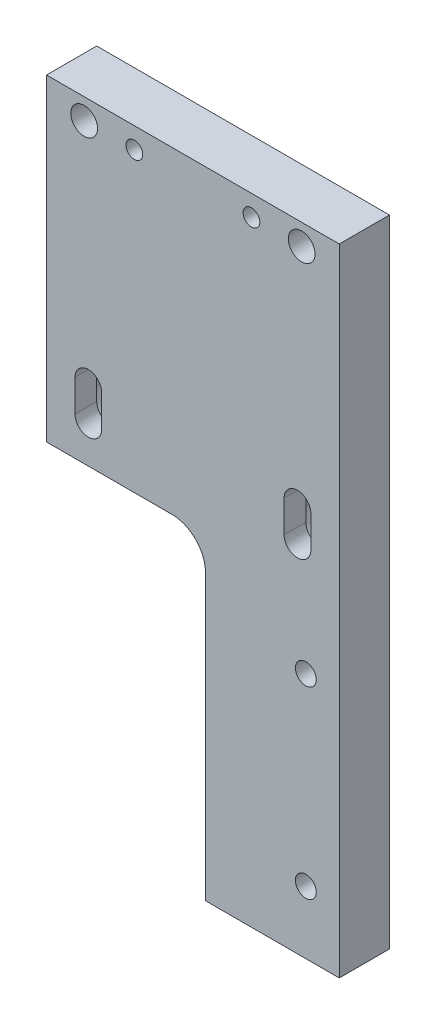
ISO-10303-21;
HEADER;
FILE_DESCRIPTION(('STEP AP214'),'2;1');
FILE_NAME('part.step','',(''),(''),'','','');
FILE_SCHEMA(('AUTOMOTIVE_DESIGN { 1 0 10303 214 1 1 1 1 }'));
ENDSEC;
DATA;
#1=APPLICATION_CONTEXT('core data for automotive mechanical design processes');
#2=APPLICATION_PROTOCOL_DEFINITION('international standard','automotive_design',2000,#1);
#3=PRODUCT_CONTEXT('',#1,'mechanical');
#4=PRODUCT('Part','Part','',(#3));
#5=PRODUCT_RELATED_PRODUCT_CATEGORY('part','',(#4));
#6=PRODUCT_DEFINITION_FORMATION('','',#4);
#7=PRODUCT_DEFINITION_CONTEXT('part definition',#1,'design');
#8=PRODUCT_DEFINITION('design','',#6,#7);
#9=PRODUCT_DEFINITION_SHAPE('','',#8);
#10=(LENGTH_UNIT() NAMED_UNIT(*) SI_UNIT(.MILLI.,.METRE.));
#11=(NAMED_UNIT(*) PLANE_ANGLE_UNIT() SI_UNIT($,.RADIAN.));
#12=(NAMED_UNIT(*) SI_UNIT($,.STERADIAN.) SOLID_ANGLE_UNIT());
#13=UNCERTAINTY_MEASURE_WITH_UNIT(LENGTH_MEASURE(1.E-05),#10,'distance_accuracy_value','');
#14=(GEOMETRIC_REPRESENTATION_CONTEXT(3) GLOBAL_UNCERTAINTY_ASSIGNED_CONTEXT((#13)) GLOBAL_UNIT_ASSIGNED_CONTEXT((#10,
#11,#12)) REPRESENTATION_CONTEXT('',''));
#15=CARTESIAN_POINT('',(0.,0.,0.));
#16=DIRECTION('',(0.,0.,1.));
#17=DIRECTION('',(1.,0.,0.));
#18=AXIS2_PLACEMENT_3D('',#15,#16,#17);
#19=CARTESIAN_POINT('',(0.,76.,0.));
#20=DIRECTION('',(0.,0.,-1.));
#21=DIRECTION('',(-1.,0.,0.));
#22=AXIS2_PLACEMENT_3D('',#19,#20,#21);
#23=PLANE('',#22);
#24=CARTESIAN_POINT('',(31.,7.5,0.));
#25=DIRECTION('',(0.,0.,-1.));
#26=DIRECTION('',(-1.,0.,0.));
#27=AXIS2_PLACEMENT_3D('',#24,#25,#26);
#28=CIRCLE('',#27,1.25);
#29=CARTESIAN_POINT('',(29.75,7.5,0.));
#30=VERTEX_POINT('',#29);
#31=EDGE_CURVE('E402',#30,#30,#28,.T.);
#32=ORIENTED_EDGE('',*,*,#31,.T.);
#33=EDGE_LOOP('',(#32));
#34=FACE_BOUND('',#33,.T.);
#35=CARTESIAN_POINT('',(31.,29.5,0.));
#36=DIRECTION('',(0.,0.,-1.));
#37=DIRECTION('',(1.,0.,0.));
#38=AXIS2_PLACEMENT_3D('',#35,#36,#37);
#39=CIRCLE('',#38,1.25);
#40=CARTESIAN_POINT('',(32.25,29.5,0.));
#41=VERTEX_POINT('',#40);
#42=EDGE_CURVE('E945',#41,#41,#39,.T.);
#43=ORIENTED_EDGE('',*,*,#42,.T.);
#44=EDGE_LOOP('',(#43));
#45=FACE_BOUND('',#44,.T.);
#46=CARTESIAN_POINT('',(15.,34.,0.));
#47=DIRECTION('',(0.,0.,-1.));
#48=DIRECTION('',(1.,0.,0.));
#49=AXIS2_PLACEMENT_3D('',#46,#47,#48);
#50=CIRCLE('',#49,4.);
#51=CARTESIAN_POINT('',(15.,38.,0.));
#52=VERTEX_POINT('',#51);
#53=CARTESIAN_POINT('',(19.,34.,0.));
#54=VERTEX_POINT('',#53);
#55=EDGE_CURVE('E346',#52,#54,#50,.T.);
#56=ORIENTED_EDGE('',*,*,#55,.T.);
#57=DIRECTION('',(0.,-1.,0.));
#58=VECTOR('',#57,1.);
#59=CARTESIAN_POINT('',(19.,0.,0.));
#60=LINE('',#59,#58);
#61=CARTESIAN_POINT('',(19.,0.,0.));
#62=VERTEX_POINT('',#61);
#63=EDGE_CURVE('E354',#54,#62,#60,.T.);
#64=ORIENTED_EDGE('',*,*,#63,.T.);
#65=DIRECTION('',(1.,0.,0.));
#66=VECTOR('',#65,1.);
#67=CARTESIAN_POINT('',(0.,0.,0.));
#68=LINE('',#67,#66);
#69=CARTESIAN_POINT('',(35.,0.,0.));
#70=VERTEX_POINT('',#69);
#71=EDGE_CURVE('E380',#62,#70,#68,.T.);
#72=ORIENTED_EDGE('',*,*,#71,.T.);
#73=DIRECTION('',(0.,-1.,0.));
#74=VECTOR('',#73,1.);
#75=CARTESIAN_POINT('',(35.,76.,0.));
#76=LINE('',#75,#74);
#77=CARTESIAN_POINT('',(35.,76.,0.));
#78=VERTEX_POINT('',#77);
#79=EDGE_CURVE('E189',#78,#70,#76,.T.);
#80=ORIENTED_EDGE('',*,*,#79,.F.);
#81=DIRECTION('',(1.,0.,0.));
#82=VECTOR('',#81,1.);
#83=CARTESIAN_POINT('',(0.,76.,0.));
#84=LINE('',#83,#82);
#85=CARTESIAN_POINT('',(0.,76.,0.));
#86=VERTEX_POINT('',#85);
#87=EDGE_CURVE('E358',#86,#78,#84,.T.);
#88=ORIENTED_EDGE('',*,*,#87,.F.);
#89=DIRECTION('',(0.,-1.,0.));
#90=VECTOR('',#89,1.);
#91=CARTESIAN_POINT('',(0.,76.,0.));
#92=LINE('',#91,#90);
#93=CARTESIAN_POINT('',(0.,38.,0.));
#94=VERTEX_POINT('',#93);
#95=EDGE_CURVE('E13',#86,#94,#92,.T.);
#96=ORIENTED_EDGE('',*,*,#95,.T.);
#97=DIRECTION('',(1.,0.,0.));
#98=VECTOR('',#97,1.);
#99=CARTESIAN_POINT('',(15.,38.,0.));
#100=LINE('',#99,#98);
#101=EDGE_CURVE('E336',#94,#52,#100,.T.);
#102=ORIENTED_EDGE('',*,*,#101,.T.);
#103=EDGE_LOOP('',(#56,#64,#72,#80,#88,#96,#102));
#104=FACE_BOUND('',#103,.T.);
#105=CARTESIAN_POINT('',(30.5,73.5,0.));
#106=DIRECTION('',(0.,0.,1.));
#107=DIRECTION('',(1.,0.,0.));
#108=AXIS2_PLACEMENT_3D('',#105,#106,#107);
#109=CIRCLE('',#108,1.60000000000001);
#110=CARTESIAN_POINT('',(32.1,73.5,0.));
#111=VERTEX_POINT('',#110);
#112=EDGE_CURVE('E375',#111,#111,#109,.T.);
#113=ORIENTED_EDGE('',*,*,#112,.F.);
#114=EDGE_LOOP('',(#113));
#115=FACE_BOUND('',#114,.T.);
#116=CARTESIAN_POINT('',(4.49999999999999,73.5,0.));
#117=DIRECTION('',(0.,0.,1.));
#118=DIRECTION('',(1.,0.,0.));
#119=AXIS2_PLACEMENT_3D('',#116,#117,#118);
#120=CIRCLE('',#119,1.6);
#121=CARTESIAN_POINT('',(6.09999999999999,73.5,0.));
#122=VERTEX_POINT('',#121);
#123=EDGE_CURVE('E555',#122,#122,#120,.T.);
#124=ORIENTED_EDGE('',*,*,#123,.F.);
#125=EDGE_LOOP('',(#124));
#126=FACE_BOUND('',#125,.T.);
#127=CARTESIAN_POINT('',(24.5,73.5,0.));
#128=DIRECTION('',(0.,0.,1.));
#129=DIRECTION('',(1.,0.,0.));
#130=AXIS2_PLACEMENT_3D('',#127,#128,#129);
#131=CIRCLE('',#130,1.);
#132=CARTESIAN_POINT('',(25.5,73.5,0.));
#133=VERTEX_POINT('',#132);
#134=EDGE_CURVE('E541',#133,#133,#131,.T.);
#135=ORIENTED_EDGE('',*,*,#134,.F.);
#136=EDGE_LOOP('',(#135));
#137=FACE_BOUND('',#136,.T.);
#138=CARTESIAN_POINT('',(10.5,73.5,0.));
#139=DIRECTION('',(0.,0.,1.));
#140=DIRECTION('',(1.,0.,0.));
#141=AXIS2_PLACEMENT_3D('',#138,#139,#140);
#142=CIRCLE('',#141,1.);
#143=CARTESIAN_POINT('',(11.5,73.5,0.));
#144=VERTEX_POINT('',#143);
#145=EDGE_CURVE('E545',#144,#144,#142,.T.);
#146=ORIENTED_EDGE('',*,*,#145,.F.);
#147=EDGE_LOOP('',(#146));
#148=FACE_BOUND('',#147,.T.);
#149=CARTESIAN_POINT('',(5.,42.6,0.));
#150=DIRECTION('',(0.,0.,-1.));
#151=DIRECTION('',(-1.,0.,0.));
#152=AXIS2_PLACEMENT_3D('',#149,#150,#151);
#153=CIRCLE('',#152,1.6);
#154=CARTESIAN_POINT('',(6.6,42.6,0.));
#155=VERTEX_POINT('',#154);
#156=CARTESIAN_POINT('',(3.4,42.6,0.));
#157=VERTEX_POINT('',#156);
#158=EDGE_CURVE('E515',#155,#157,#153,.T.);
#159=ORIENTED_EDGE('',*,*,#158,.T.);
#160=DIRECTION('',(0.,1.,0.));
#161=VECTOR('',#160,1.);
#162=CARTESIAN_POINT('',(3.4,42.6,0.));
#163=LINE('',#162,#161);
#164=CARTESIAN_POINT('',(3.4,46.4,0.));
#165=VERTEX_POINT('',#164);
#166=EDGE_CURVE('E484',#157,#165,#163,.T.);
#167=ORIENTED_EDGE('',*,*,#166,.T.);
#168=CARTESIAN_POINT('',(5.,46.4,0.));
#169=DIRECTION('',(0.,0.,-1.));
#170=DIRECTION('',(-1.,0.,0.));
#171=AXIS2_PLACEMENT_3D('',#168,#169,#170);
#172=CIRCLE('',#171,1.6);
#173=CARTESIAN_POINT('',(6.6,46.4,0.));
#174=VERTEX_POINT('',#173);
#175=EDGE_CURVE('E535',#165,#174,#172,.T.);
#176=ORIENTED_EDGE('',*,*,#175,.T.);
#177=DIRECTION('',(0.,1.,0.));
#178=VECTOR('',#177,1.);
#179=CARTESIAN_POINT('',(6.6,42.6,0.));
#180=LINE('',#179,#178);
#181=EDGE_CURVE('E487',#155,#174,#180,.T.);
#182=ORIENTED_EDGE('',*,*,#181,.F.);
#183=EDGE_LOOP('',(#159,#167,#176,#182));
#184=FACE_BOUND('',#183,.T.);
#185=DIRECTION('',(0.,1.,0.));
#186=VECTOR('',#185,1.);
#187=CARTESIAN_POINT('',(31.6,42.6,0.));
#188=LINE('',#187,#186);
#189=CARTESIAN_POINT('',(31.6,42.6,0.));
#190=VERTEX_POINT('',#189);
#191=CARTESIAN_POINT('',(31.6,46.4,0.));
#192=VERTEX_POINT('',#191);
#193=EDGE_CURVE('E425',#190,#192,#188,.T.);
#194=ORIENTED_EDGE('',*,*,#193,.F.);
#195=CARTESIAN_POINT('',(30.,42.6,0.));
#196=DIRECTION('',(0.,0.,-1.));
#197=DIRECTION('',(-1.,0.,0.));
#198=AXIS2_PLACEMENT_3D('',#195,#196,#197);
#199=CIRCLE('',#198,1.6);
#200=CARTESIAN_POINT('',(28.4,42.6,0.));
#201=VERTEX_POINT('',#200);
#202=EDGE_CURVE('E454',#190,#201,#199,.T.);
#203=ORIENTED_EDGE('',*,*,#202,.T.);
#204=DIRECTION('',(0.,1.,0.));
#205=VECTOR('',#204,1.);
#206=CARTESIAN_POINT('',(28.4,42.6,0.));
#207=LINE('',#206,#205);
#208=CARTESIAN_POINT('',(28.4,46.4,0.));
#209=VERTEX_POINT('',#208);
#210=EDGE_CURVE('E422',#201,#209,#207,.T.);
#211=ORIENTED_EDGE('',*,*,#210,.T.);
#212=CARTESIAN_POINT('',(30.,46.4,0.));
#213=DIRECTION('',(0.,0.,-1.));
#214=DIRECTION('',(-1.,0.,0.));
#215=AXIS2_PLACEMENT_3D('',#212,#213,#214);
#216=CIRCLE('',#215,1.6);
#217=EDGE_CURVE('E204',#209,#192,#216,.T.);
#218=ORIENTED_EDGE('',*,*,#217,.T.);
#219=EDGE_LOOP('',(#194,#203,#211,#218));
#220=FACE_BOUND('',#219,.T.);
#221=ADVANCED_FACE('F181',(#34,#45,#104,#115,#126,#137,#148,#184,#220),#23,.F.);
#222=CARTESIAN_POINT('',(0.,76.,0.));
#223=DIRECTION('',(1.,0.,0.));
#224=DIRECTION('',(0.,0.,-1.));
#225=AXIS2_PLACEMENT_3D('',#222,#223,#224);
#226=PLANE('',#225);
#227=DIRECTION('',(0.,-1.,0.));
#228=VECTOR('',#227,1.);
#229=CARTESIAN_POINT('',(0.,76.,-6.));
#230=LINE('',#229,#228);
#231=CARTESIAN_POINT('',(0.,76.,-6.));
#232=VERTEX_POINT('',#231);
#233=CARTESIAN_POINT('',(0.,38.,-6.));
#234=VERTEX_POINT('',#233);
#235=EDGE_CURVE('E353',#232,#234,#230,.T.);
#236=ORIENTED_EDGE('',*,*,#235,.T.);
#237=DIRECTION('',(0.,0.,-1.));
#238=VECTOR('',#237,1.);
#239=CARTESIAN_POINT('',(0.,38.,0.));
#240=LINE('',#239,#238);
#241=EDGE_CURVE('E340',#94,#234,#240,.T.);
#242=ORIENTED_EDGE('',*,*,#241,.F.);
#243=ORIENTED_EDGE('',*,*,#95,.F.);
#244=DIRECTION('',(0.,0.,1.));
#245=VECTOR('',#244,1.);
#246=CARTESIAN_POINT('',(0.,76.,0.));
#247=LINE('',#246,#245);
#248=EDGE_CURVE('E364',#232,#86,#247,.T.);
#249=ORIENTED_EDGE('',*,*,#248,.F.);
#250=EDGE_LOOP('',(#236,#242,#243,#249));
#251=FACE_BOUND('',#250,.T.);
#252=ADVANCED_FACE('F183',(#251),#226,.F.);
#253=CARTESIAN_POINT('',(35.,76.,0.));
#254=DIRECTION('',(-1.,0.,0.));
#255=DIRECTION('',(0.,0.,1.));
#256=AXIS2_PLACEMENT_3D('',#253,#254,#255);
#257=PLANE('',#256);
#258=DIRECTION('',(0.,0.,-1.));
#259=VECTOR('',#258,1.);
#260=CARTESIAN_POINT('',(35.,0.,0.));
#261=LINE('',#260,#259);
#262=CARTESIAN_POINT('',(35.,0.,-6.));
#263=VERTEX_POINT('',#262);
#264=EDGE_CURVE('E372',#70,#263,#261,.T.);
#265=ORIENTED_EDGE('',*,*,#264,.T.);
#266=DIRECTION('',(0.,-1.,0.));
#267=VECTOR('',#266,1.);
#268=CARTESIAN_POINT('',(35.,76.,-6.));
#269=LINE('',#268,#267);
#270=CARTESIAN_POINT('',(35.,76.,-6.));
#271=VERTEX_POINT('',#270);
#272=EDGE_CURVE('E385',#271,#263,#269,.T.);
#273=ORIENTED_EDGE('',*,*,#272,.F.);
#274=DIRECTION('',(0.,0.,-1.));
#275=VECTOR('',#274,1.);
#276=CARTESIAN_POINT('',(35.,76.,0.));
#277=LINE('',#276,#275);
#278=EDGE_CURVE('E363',#78,#271,#277,.T.);
#279=ORIENTED_EDGE('',*,*,#278,.F.);
#280=ORIENTED_EDGE('',*,*,#79,.T.);
#281=EDGE_LOOP('',(#265,#273,#279,#280));
#282=FACE_BOUND('',#281,.T.);
#283=ADVANCED_FACE('F389',(#282),#257,.F.);
#284=CARTESIAN_POINT('',(0.,76.,-6.));
#285=DIRECTION('',(0.,0.,1.));
#286=DIRECTION('',(1.,0.,0.));
#287=AXIS2_PLACEMENT_3D('',#284,#285,#286);
#288=PLANE('',#287);
#289=CARTESIAN_POINT('',(31.,7.5,-6.));
#290=DIRECTION('',(0.,0.,-1.));
#291=DIRECTION('',(-1.,0.,0.));
#292=AXIS2_PLACEMENT_3D('',#289,#290,#291);
#293=CIRCLE('',#292,1.25);
#294=CARTESIAN_POINT('',(29.75,7.5,-6.));
#295=VERTEX_POINT('',#294);
#296=EDGE_CURVE('E406',#295,#295,#293,.T.);
#297=ORIENTED_EDGE('',*,*,#296,.F.);
#298=EDGE_LOOP('',(#297));
#299=FACE_BOUND('',#298,.T.);
#300=CARTESIAN_POINT('',(31.,29.5,-6.));
#301=DIRECTION('',(0.,0.,-1.));
#302=DIRECTION('',(1.,0.,0.));
#303=AXIS2_PLACEMENT_3D('',#300,#301,#302);
#304=CIRCLE('',#303,1.25);
#305=CARTESIAN_POINT('',(32.25,29.5,-6.));
#306=VERTEX_POINT('',#305);
#307=EDGE_CURVE('E942',#306,#306,#304,.T.);
#308=ORIENTED_EDGE('',*,*,#307,.F.);
#309=EDGE_LOOP('',(#308));
#310=FACE_BOUND('',#309,.T.);
#311=DIRECTION('',(0.,1.,0.));
#312=VECTOR('',#311,1.);
#313=CARTESIAN_POINT('',(33.25,42.6,-6.));
#314=LINE('',#313,#312);
#315=CARTESIAN_POINT('',(33.25,42.6,-6.));
#316=VERTEX_POINT('',#315);
#317=CARTESIAN_POINT('',(33.25,46.4,-6.));
#318=VERTEX_POINT('',#317);
#319=EDGE_CURVE('E433',#316,#318,#314,.T.);
#320=ORIENTED_EDGE('',*,*,#319,.T.);
#321=CARTESIAN_POINT('',(30.,46.4,-6.));
#322=DIRECTION('',(0.,0.,-1.));
#323=DIRECTION('',(-1.,0.,0.));
#324=AXIS2_PLACEMENT_3D('',#321,#322,#323);
#325=CIRCLE('',#324,3.25);
#326=CARTESIAN_POINT('',(26.75,46.4,-6.));
#327=VERTEX_POINT('',#326);
#328=EDGE_CURVE('E465',#327,#318,#325,.T.);
#329=ORIENTED_EDGE('',*,*,#328,.F.);
#330=DIRECTION('',(0.,1.,0.));
#331=VECTOR('',#330,1.);
#332=CARTESIAN_POINT('',(26.75,42.6,-6.));
#333=LINE('',#332,#331);
#334=CARTESIAN_POINT('',(26.75,42.6,-6.));
#335=VERTEX_POINT('',#334);
#336=EDGE_CURVE('E413',#335,#327,#333,.T.);
#337=ORIENTED_EDGE('',*,*,#336,.F.);
#338=CARTESIAN_POINT('',(30.,42.6,-6.));
#339=DIRECTION('',(0.,0.,-1.));
#340=DIRECTION('',(-1.,0.,0.));
#341=AXIS2_PLACEMENT_3D('',#338,#339,#340);
#342=CIRCLE('',#341,3.25);
#343=EDGE_CURVE('E445',#316,#335,#342,.T.);
#344=ORIENTED_EDGE('',*,*,#343,.F.);
#345=EDGE_LOOP('',(#320,#329,#337,#344));
#346=FACE_BOUND('',#345,.T.);
#347=CARTESIAN_POINT('',(5.,46.4,-6.));
#348=DIRECTION('',(0.,0.,-1.));
#349=DIRECTION('',(-1.,0.,0.));
#350=AXIS2_PLACEMENT_3D('',#347,#348,#349);
#351=CIRCLE('',#350,3.25);
#352=CARTESIAN_POINT('',(1.75000000000003,46.4,-6.));
#353=VERTEX_POINT('',#352);
#354=CARTESIAN_POINT('',(8.25,46.4,-6.));
#355=VERTEX_POINT('',#354);
#356=EDGE_CURVE('E527',#353,#355,#351,.T.);
#357=ORIENTED_EDGE('',*,*,#356,.F.);
#358=DIRECTION('',(0.,1.,0.));
#359=VECTOR('',#358,1.);
#360=CARTESIAN_POINT('',(1.75000000000003,42.6,-6.));
#361=LINE('',#360,#359);
#362=CARTESIAN_POINT('',(1.75000000000001,42.6,-6.));
#363=VERTEX_POINT('',#362);
#364=EDGE_CURVE('E478',#363,#353,#361,.T.);
#365=ORIENTED_EDGE('',*,*,#364,.F.);
#366=CARTESIAN_POINT('',(5.,42.6,-6.));
#367=DIRECTION('',(0.,0.,-1.));
#368=DIRECTION('',(-1.,0.,0.));
#369=AXIS2_PLACEMENT_3D('',#366,#367,#368);
#370=CIRCLE('',#369,3.25);
#371=CARTESIAN_POINT('',(8.25,42.6,-6.));
#372=VERTEX_POINT('',#371);
#373=EDGE_CURVE('E506',#372,#363,#370,.T.);
#374=ORIENTED_EDGE('',*,*,#373,.F.);
#375=DIRECTION('',(0.,1.,0.));
#376=VECTOR('',#375,1.);
#377=CARTESIAN_POINT('',(8.25,42.6,-6.));
#378=LINE('',#377,#376);
#379=EDGE_CURVE('E494',#372,#355,#378,.T.);
#380=ORIENTED_EDGE('',*,*,#379,.T.);
#381=EDGE_LOOP('',(#357,#365,#374,#380));
#382=FACE_BOUND('',#381,.T.);
#383=CARTESIAN_POINT('',(4.49999999999999,73.5,-6.));
#384=DIRECTION('',(0.,0.,1.));
#385=DIRECTION('',(1.,0.,0.));
#386=AXIS2_PLACEMENT_3D('',#383,#384,#385);
#387=CIRCLE('',#386,1.6);
#388=CARTESIAN_POINT('',(6.09999999999999,73.5,-6.));
#389=VERTEX_POINT('',#388);
#390=EDGE_CURVE('E382',#389,#389,#387,.T.);
#391=ORIENTED_EDGE('',*,*,#390,.T.);
#392=EDGE_LOOP('',(#391));
#393=FACE_BOUND('',#392,.T.);
#394=CARTESIAN_POINT('',(30.5,73.5,-6.));
#395=DIRECTION('',(0.,0.,1.));
#396=DIRECTION('',(1.,0.,0.));
#397=AXIS2_PLACEMENT_3D('',#394,#395,#396);
#398=CIRCLE('',#397,1.60000000000001);
#399=CARTESIAN_POINT('',(32.1,73.5,-6.));
#400=VERTEX_POINT('',#399);
#401=EDGE_CURVE('E557',#400,#400,#398,.T.);
#402=ORIENTED_EDGE('',*,*,#401,.T.);
#403=EDGE_LOOP('',(#402));
#404=FACE_BOUND('',#403,.T.);
#405=DIRECTION('',(-1.,0.,0.));
#406=VECTOR('',#405,1.);
#407=CARTESIAN_POINT('',(0.,0.,-6.));
#408=LINE('',#407,#406);
#409=CARTESIAN_POINT('',(19.,0.,-6.));
#410=VERTEX_POINT('',#409);
#411=EDGE_CURVE('E369',#263,#410,#408,.T.);
#412=ORIENTED_EDGE('',*,*,#411,.T.);
#413=DIRECTION('',(0.,-1.,0.));
#414=VECTOR('',#413,1.);
#415=CARTESIAN_POINT('',(19.,0.,-6.));
#416=LINE('',#415,#414);
#417=CARTESIAN_POINT('',(19.,34.,-6.));
#418=VERTEX_POINT('',#417);
#419=EDGE_CURVE('E196',#418,#410,#416,.T.);
#420=ORIENTED_EDGE('',*,*,#419,.F.);
#421=CARTESIAN_POINT('',(15.,34.,-6.));
#422=DIRECTION('',(0.,0.,-1.));
#423=DIRECTION('',(1.,0.,0.));
#424=AXIS2_PLACEMENT_3D('',#421,#422,#423);
#425=CIRCLE('',#424,4.);
#426=CARTESIAN_POINT('',(15.,38.,-6.));
#427=VERTEX_POINT('',#426);
#428=EDGE_CURVE('E401',#427,#418,#425,.T.);
#429=ORIENTED_EDGE('',*,*,#428,.F.);
#430=DIRECTION('',(1.,0.,0.));
#431=VECTOR('',#430,1.);
#432=CARTESIAN_POINT('',(15.,38.,-6.));
#433=LINE('',#432,#431);
#434=EDGE_CURVE('E399',#234,#427,#433,.T.);
#435=ORIENTED_EDGE('',*,*,#434,.F.);
#436=ORIENTED_EDGE('',*,*,#235,.F.);
#437=DIRECTION('',(-1.,0.,0.));
#438=VECTOR('',#437,1.);
#439=CARTESIAN_POINT('',(0.,76.,-6.));
#440=LINE('',#439,#438);
#441=EDGE_CURVE('E368',#271,#232,#440,.T.);
#442=ORIENTED_EDGE('',*,*,#441,.F.);
#443=ORIENTED_EDGE('',*,*,#272,.T.);
#444=EDGE_LOOP('',(#412,#420,#429,#435,#436,#442,#443));
#445=FACE_BOUND('',#444,.T.);
#446=ADVANCED_FACE('F397',(#299,#310,#346,#382,#393,#404,#445),#288,.F.);
#447=CARTESIAN_POINT('',(0.,76.,0.));
#448=DIRECTION('',(0.,-1.,0.));
#449=DIRECTION('',(0.,0.,-1.));
#450=AXIS2_PLACEMENT_3D('',#447,#448,#449);
#451=PLANE('',#450);
#452=ORIENTED_EDGE('',*,*,#248,.T.);
#453=ORIENTED_EDGE('',*,*,#87,.T.);
#454=ORIENTED_EDGE('',*,*,#278,.T.);
#455=ORIENTED_EDGE('',*,*,#441,.T.);
#456=EDGE_LOOP('',(#452,#453,#454,#455));
#457=FACE_BOUND('',#456,.T.);
#458=ADVANCED_FACE('F366',(#457),#451,.F.);
#459=CARTESIAN_POINT('',(0.,0.,0.));
#460=DIRECTION('',(0.,-1.,0.));
#461=DIRECTION('',(0.,0.,-1.));
#462=AXIS2_PLACEMENT_3D('',#459,#460,#461);
#463=PLANE('',#462);
#464=DIRECTION('',(0.,0.,-1.));
#465=VECTOR('',#464,1.);
#466=CARTESIAN_POINT('',(19.,0.,0.));
#467=LINE('',#466,#465);
#468=EDGE_CURVE('E395',#62,#410,#467,.T.);
#469=ORIENTED_EDGE('',*,*,#468,.T.);
#470=ORIENTED_EDGE('',*,*,#411,.F.);
#471=ORIENTED_EDGE('',*,*,#264,.F.);
#472=ORIENTED_EDGE('',*,*,#71,.F.);
#473=EDGE_LOOP('',(#469,#470,#471,#472));
#474=FACE_BOUND('',#473,.T.);
#475=ADVANCED_FACE('F394',(#474),#463,.T.);
#476=CARTESIAN_POINT('',(30.5,73.5,-6.));
#477=DIRECTION('',(0.,0.,1.));
#478=DIRECTION('',(1.,0.,0.));
#479=AXIS2_PLACEMENT_3D('',#476,#477,#478);
#480=CYLINDRICAL_SURFACE('',#479,1.60000000000001);
#481=ORIENTED_EDGE('',*,*,#401,.F.);
#482=EDGE_LOOP('',(#481));
#483=FACE_BOUND('',#482,.T.);
#484=ORIENTED_EDGE('',*,*,#112,.T.);
#485=EDGE_LOOP('',(#484));
#486=FACE_BOUND('',#485,.T.);
#487=ADVANCED_FACE('F564',(#483,#486),#480,.F.);
#488=CARTESIAN_POINT('',(4.49999999999999,73.5,-6.));
#489=DIRECTION('',(0.,0.,1.));
#490=DIRECTION('',(1.,0.,0.));
#491=AXIS2_PLACEMENT_3D('',#488,#489,#490);
#492=CYLINDRICAL_SURFACE('',#491,1.6);
#493=ORIENTED_EDGE('',*,*,#390,.F.);
#494=EDGE_LOOP('',(#493));
#495=FACE_BOUND('',#494,.T.);
#496=ORIENTED_EDGE('',*,*,#123,.T.);
#497=EDGE_LOOP('',(#496));
#498=FACE_BOUND('',#497,.T.);
#499=ADVANCED_FACE('F652',(#495,#498),#492,.F.);
#500=CARTESIAN_POINT('',(24.5,73.5,-4.));
#501=DIRECTION('',(0.,0.,1.));
#502=DIRECTION('',(1.,0.,0.));
#503=AXIS2_PLACEMENT_3D('',#500,#501,#502);
#504=CYLINDRICAL_SURFACE('',#503,1.);
#505=CARTESIAN_POINT('',(24.5,73.5,-4.));
#506=DIRECTION('',(0.,0.,1.));
#507=DIRECTION('',(1.,0.,0.));
#508=AXIS2_PLACEMENT_3D('',#505,#506,#507);
#509=CIRCLE('',#508,1.);
#510=CARTESIAN_POINT('',(25.5,73.5,-4.));
#511=VERTEX_POINT('',#510);
#512=EDGE_CURVE('E548',#511,#511,#509,.T.);
#513=ORIENTED_EDGE('',*,*,#512,.F.);
#514=EDGE_LOOP('',(#513));
#515=FACE_BOUND('',#514,.T.);
#516=ORIENTED_EDGE('',*,*,#134,.T.);
#517=EDGE_LOOP('',(#516));
#518=FACE_BOUND('',#517,.T.);
#519=ADVANCED_FACE('F648',(#515,#518),#504,.F.);
#520=CARTESIAN_POINT('',(24.5,73.5,-4.));
#521=DIRECTION('',(0.,0.,1.));
#522=DIRECTION('',(1.,0.,0.));
#523=AXIS2_PLACEMENT_3D('',#520,#521,#522);
#524=PLANE('',#523);
#525=ORIENTED_EDGE('',*,*,#512,.T.);
#526=EDGE_LOOP('',(#525));
#527=FACE_BOUND('',#526,.T.);
#528=ADVANCED_FACE('F644',(#527),#524,.T.);
#529=CARTESIAN_POINT('',(10.5,73.5,-4.));
#530=DIRECTION('',(0.,0.,1.));
#531=DIRECTION('',(1.,0.,0.));
#532=AXIS2_PLACEMENT_3D('',#529,#530,#531);
#533=CYLINDRICAL_SURFACE('',#532,1.);
#534=CARTESIAN_POINT('',(10.5,73.5,-4.));
#535=DIRECTION('',(0.,0.,1.));
#536=DIRECTION('',(1.,0.,0.));
#537=AXIS2_PLACEMENT_3D('',#534,#535,#536);
#538=CIRCLE('',#537,1.);
#539=CARTESIAN_POINT('',(11.5,73.5,-4.));
#540=VERTEX_POINT('',#539);
#541=EDGE_CURVE('E542',#540,#540,#538,.T.);
#542=ORIENTED_EDGE('',*,*,#541,.F.);
#543=EDGE_LOOP('',(#542));
#544=FACE_BOUND('',#543,.T.);
#545=ORIENTED_EDGE('',*,*,#145,.T.);
#546=EDGE_LOOP('',(#545));
#547=FACE_BOUND('',#546,.T.);
#548=ADVANCED_FACE('F640',(#544,#547),#533,.F.);
#549=CARTESIAN_POINT('',(10.5,73.5,-4.));
#550=DIRECTION('',(0.,0.,1.));
#551=DIRECTION('',(1.,0.,0.));
#552=AXIS2_PLACEMENT_3D('',#549,#550,#551);
#553=PLANE('',#552);
#554=ORIENTED_EDGE('',*,*,#541,.T.);
#555=EDGE_LOOP('',(#554));
#556=FACE_BOUND('',#555,.T.);
#557=ADVANCED_FACE('F636',(#556),#553,.T.);
#558=CARTESIAN_POINT('',(5.,46.4,-6.));
#559=DIRECTION('',(0.,0.,-1.));
#560=DIRECTION('',(-1.,0.,0.));
#561=AXIS2_PLACEMENT_3D('',#558,#559,#560);
#562=CYLINDRICAL_SURFACE('',#561,1.6);
#563=CARTESIAN_POINT('',(5.,46.4,-2.6));
#564=DIRECTION('',(0.,0.,-1.));
#565=DIRECTION('',(-1.,0.,0.));
#566=AXIS2_PLACEMENT_3D('',#563,#564,#565);
#567=CIRCLE('',#566,1.6);
#568=CARTESIAN_POINT('',(3.4,46.4,-2.6));
#569=VERTEX_POINT('',#568);
#570=CARTESIAN_POINT('',(6.6,46.4,-2.6));
#571=VERTEX_POINT('',#570);
#572=EDGE_CURVE('E532',#569,#571,#567,.T.);
#573=ORIENTED_EDGE('',*,*,#572,.T.);
#574=DIRECTION('',(0.,0.,1.));
#575=VECTOR('',#574,1.);
#576=CARTESIAN_POINT('',(6.6,46.4,0.));
#577=LINE('',#576,#575);
#578=EDGE_CURVE('E524',#571,#174,#577,.T.);
#579=ORIENTED_EDGE('',*,*,#578,.T.);
#580=ORIENTED_EDGE('',*,*,#175,.F.);
#581=DIRECTION('',(0.,0.,-1.));
#582=VECTOR('',#581,1.);
#583=CARTESIAN_POINT('',(3.4,46.4,-6.));
#584=LINE('',#583,#582);
#585=EDGE_CURVE('E520',#569,#165,#584,.F.);
#586=ORIENTED_EDGE('',*,*,#585,.F.);
#587=EDGE_LOOP('',(#573,#579,#580,#586));
#588=FACE_BOUND('',#587,.T.);
#589=ADVANCED_FACE('F632',(#588),#562,.F.);
#590=CARTESIAN_POINT('',(6.6,46.4,-2.6));
#591=DIRECTION('',(0.,0.,1.));
#592=DIRECTION('',(1.,0.,0.));
#593=AXIS2_PLACEMENT_3D('',#590,#591,#592);
#594=PLANE('',#593);
#595=ORIENTED_EDGE('',*,*,#572,.F.);
#596=DIRECTION('',(0.,1.,0.));
#597=VECTOR('',#596,1.);
#598=CARTESIAN_POINT('',(3.4,42.6,-2.6));
#599=LINE('',#598,#597);
#600=CARTESIAN_POINT('',(3.4,42.6,-2.6));
#601=VERTEX_POINT('',#600);
#602=EDGE_CURVE('E482',#601,#569,#599,.T.);
#603=ORIENTED_EDGE('',*,*,#602,.F.);
#604=CARTESIAN_POINT('',(5.,42.6,-2.6));
#605=DIRECTION('',(0.,0.,-1.));
#606=DIRECTION('',(-1.,0.,0.));
#607=AXIS2_PLACEMENT_3D('',#604,#605,#606);
#608=CIRCLE('',#607,1.6);
#609=CARTESIAN_POINT('',(6.6,42.6,-2.6));
#610=VERTEX_POINT('',#609);
#611=EDGE_CURVE('E512',#610,#601,#608,.T.);
#612=ORIENTED_EDGE('',*,*,#611,.F.);
#613=DIRECTION('',(0.,1.,0.));
#614=VECTOR('',#613,1.);
#615=CARTESIAN_POINT('',(6.6,42.6,-2.6));
#616=LINE('',#615,#614);
#617=EDGE_CURVE('E489',#610,#571,#616,.T.);
#618=ORIENTED_EDGE('',*,*,#617,.T.);
#619=EDGE_LOOP('',(#595,#603,#612,#618));
#620=FACE_BOUND('',#619,.T.);
#621=CARTESIAN_POINT('',(5.,46.4,-2.6));
#622=DIRECTION('',(0.,0.,-1.));
#623=DIRECTION('',(-1.,0.,0.));
#624=AXIS2_PLACEMENT_3D('',#621,#622,#623);
#625=CIRCLE('',#624,3.25);
#626=CARTESIAN_POINT('',(1.75000000000001,46.4,-2.6));
#627=VERTEX_POINT('',#626);
#628=CARTESIAN_POINT('',(8.25,46.4,-2.6));
#629=VERTEX_POINT('',#628);
#630=EDGE_CURVE('E529',#627,#629,#625,.T.);
#631=ORIENTED_EDGE('',*,*,#630,.T.);
#632=DIRECTION('',(0.,1.,0.));
#633=VECTOR('',#632,1.);
#634=CARTESIAN_POINT('',(8.25,42.6,-2.6));
#635=LINE('',#634,#633);
#636=CARTESIAN_POINT('',(8.25,42.6,-2.6));
#637=VERTEX_POINT('',#636);
#638=EDGE_CURVE('E491',#637,#629,#635,.T.);
#639=ORIENTED_EDGE('',*,*,#638,.F.);
#640=CARTESIAN_POINT('',(5.,42.6,-2.6));
#641=DIRECTION('',(0.,0.,-1.));
#642=DIRECTION('',(-1.,0.,0.));
#643=AXIS2_PLACEMENT_3D('',#640,#641,#642);
#644=CIRCLE('',#643,3.25);
#645=CARTESIAN_POINT('',(1.75000000000001,42.6,-2.6));
#646=VERTEX_POINT('',#645);
#647=EDGE_CURVE('E509',#637,#646,#644,.T.);
#648=ORIENTED_EDGE('',*,*,#647,.T.);
#649=DIRECTION('',(0.,1.,0.));
#650=VECTOR('',#649,1.);
#651=CARTESIAN_POINT('',(1.75000000000001,42.6,-2.6));
#652=LINE('',#651,#650);
#653=EDGE_CURVE('E480',#646,#627,#652,.T.);
#654=ORIENTED_EDGE('',*,*,#653,.T.);
#655=EDGE_LOOP('',(#631,#639,#648,#654));
#656=FACE_BOUND('',#655,.T.);
#657=ADVANCED_FACE('F628',(#620,#656),#594,.F.);
#658=CARTESIAN_POINT('',(5.,46.4,-6.));
#659=DIRECTION('',(0.,0.,-1.));
#660=DIRECTION('',(-1.,0.,0.));
#661=AXIS2_PLACEMENT_3D('',#658,#659,#660);
#662=CYLINDRICAL_SURFACE('',#661,3.25);
#663=ORIENTED_EDGE('',*,*,#356,.T.);
#664=DIRECTION('',(0.,0.,1.));
#665=VECTOR('',#664,1.);
#666=CARTESIAN_POINT('',(8.25,46.4,-2.6));
#667=LINE('',#666,#665);
#668=EDGE_CURVE('E522',#355,#629,#667,.T.);
#669=ORIENTED_EDGE('',*,*,#668,.T.);
#670=ORIENTED_EDGE('',*,*,#630,.F.);
#671=DIRECTION('',(0.,0.,-1.));
#672=VECTOR('',#671,1.);
#673=CARTESIAN_POINT('',(1.75000000000001,46.4,-6.));
#674=LINE('',#673,#672);
#675=EDGE_CURVE('E538',#353,#627,#674,.F.);
#676=ORIENTED_EDGE('',*,*,#675,.F.);
#677=EDGE_LOOP('',(#663,#669,#670,#676));
#678=FACE_BOUND('',#677,.T.);
#679=ADVANCED_FACE('F624',(#678),#662,.F.);
#680=CARTESIAN_POINT('',(5.,42.6,-6.));
#681=DIRECTION('',(0.,0.,-1.));
#682=DIRECTION('',(-1.,0.,0.));
#683=AXIS2_PLACEMENT_3D('',#680,#681,#682);
#684=CYLINDRICAL_SURFACE('',#683,1.6);
#685=ORIENTED_EDGE('',*,*,#158,.F.);
#686=DIRECTION('',(0.,0.,1.));
#687=VECTOR('',#686,1.);
#688=CARTESIAN_POINT('',(6.6,42.6,0.));
#689=LINE('',#688,#687);
#690=EDGE_CURVE('E503',#610,#155,#689,.T.);
#691=ORIENTED_EDGE('',*,*,#690,.F.);
#692=ORIENTED_EDGE('',*,*,#611,.T.);
#693=DIRECTION('',(0.,0.,-1.));
#694=VECTOR('',#693,1.);
#695=CARTESIAN_POINT('',(3.4,42.6,-6.));
#696=LINE('',#695,#694);
#697=EDGE_CURVE('E497',#157,#601,#696,.T.);
#698=ORIENTED_EDGE('',*,*,#697,.F.);
#699=EDGE_LOOP('',(#685,#691,#692,#698));
#700=FACE_BOUND('',#699,.T.);
#701=ADVANCED_FACE('F620',(#700),#684,.F.);
#702=CARTESIAN_POINT('',(5.,42.6,-6.));
#703=DIRECTION('',(0.,0.,-1.));
#704=DIRECTION('',(-1.,0.,0.));
#705=AXIS2_PLACEMENT_3D('',#702,#703,#704);
#706=CYLINDRICAL_SURFACE('',#705,3.25);
#707=ORIENTED_EDGE('',*,*,#647,.F.);
#708=DIRECTION('',(0.,0.,1.));
#709=VECTOR('',#708,1.);
#710=CARTESIAN_POINT('',(8.25,42.6,-2.6));
#711=LINE('',#710,#709);
#712=EDGE_CURVE('E500',#372,#637,#711,.T.);
#713=ORIENTED_EDGE('',*,*,#712,.F.);
#714=ORIENTED_EDGE('',*,*,#373,.T.);
#715=DIRECTION('',(0.,0.,-1.));
#716=VECTOR('',#715,1.);
#717=CARTESIAN_POINT('',(1.75000000000001,42.6,-6.));
#718=LINE('',#717,#716);
#719=EDGE_CURVE('E518',#646,#363,#718,.T.);
#720=ORIENTED_EDGE('',*,*,#719,.F.);
#721=EDGE_LOOP('',(#707,#713,#714,#720));
#722=FACE_BOUND('',#721,.T.);
#723=ADVANCED_FACE('F616',(#722),#706,.F.);
#724=CARTESIAN_POINT('',(8.25,42.6,-2.6));
#725=DIRECTION('',(-1.,0.,0.));
#726=DIRECTION('',(0.,0.,1.));
#727=AXIS2_PLACEMENT_3D('',#724,#725,#726);
#728=PLANE('',#727);
#729=ORIENTED_EDGE('',*,*,#668,.F.);
#730=ORIENTED_EDGE('',*,*,#379,.F.);
#731=ORIENTED_EDGE('',*,*,#712,.T.);
#732=ORIENTED_EDGE('',*,*,#638,.T.);
#733=EDGE_LOOP('',(#729,#730,#731,#732));
#734=FACE_BOUND('',#733,.T.);
#735=ADVANCED_FACE('F612',(#734),#728,.T.);
#736=CARTESIAN_POINT('',(6.6,42.6,0.));
#737=DIRECTION('',(-1.,0.,0.));
#738=DIRECTION('',(0.,0.,1.));
#739=AXIS2_PLACEMENT_3D('',#736,#737,#738);
#740=PLANE('',#739);
#741=ORIENTED_EDGE('',*,*,#578,.F.);
#742=ORIENTED_EDGE('',*,*,#617,.F.);
#743=ORIENTED_EDGE('',*,*,#690,.T.);
#744=ORIENTED_EDGE('',*,*,#181,.T.);
#745=EDGE_LOOP('',(#741,#742,#743,#744));
#746=FACE_BOUND('',#745,.T.);
#747=ADVANCED_FACE('F608',(#746),#740,.T.);
#748=CARTESIAN_POINT('',(3.4,42.6,-6.));
#749=DIRECTION('',(-1.,0.,0.));
#750=DIRECTION('',(0.,0.,1.));
#751=AXIS2_PLACEMENT_3D('',#748,#749,#750);
#752=PLANE('',#751);
#753=ORIENTED_EDGE('',*,*,#585,.T.);
#754=ORIENTED_EDGE('',*,*,#166,.F.);
#755=ORIENTED_EDGE('',*,*,#697,.T.);
#756=ORIENTED_EDGE('',*,*,#602,.T.);
#757=EDGE_LOOP('',(#753,#754,#755,#756));
#758=FACE_BOUND('',#757,.T.);
#759=ADVANCED_FACE('F601',(#758),#752,.F.);
#760=CARTESIAN_POINT('',(1.75000000000001,42.6,-6.));
#761=DIRECTION('',(-1.,0.,0.));
#762=DIRECTION('',(0.,0.,1.));
#763=AXIS2_PLACEMENT_3D('',#760,#761,#762);
#764=PLANE('',#763);
#765=ORIENTED_EDGE('',*,*,#675,.T.);
#766=ORIENTED_EDGE('',*,*,#653,.F.);
#767=ORIENTED_EDGE('',*,*,#719,.T.);
#768=ORIENTED_EDGE('',*,*,#364,.T.);
#769=EDGE_LOOP('',(#765,#766,#767,#768));
#770=FACE_BOUND('',#769,.T.);
#771=ADVANCED_FACE('F593',(#770),#764,.F.);
#772=CARTESIAN_POINT('',(30.,46.4,-6.));
#773=DIRECTION('',(0.,0.,-1.));
#774=DIRECTION('',(-1.,0.,0.));
#775=AXIS2_PLACEMENT_3D('',#772,#773,#774);
#776=CYLINDRICAL_SURFACE('',#775,1.6);
#777=CARTESIAN_POINT('',(30.,46.4,-2.6));
#778=DIRECTION('',(0.,0.,-1.));
#779=DIRECTION('',(-1.,0.,0.));
#780=AXIS2_PLACEMENT_3D('',#777,#778,#779);
#781=CIRCLE('',#780,1.6);
#782=CARTESIAN_POINT('',(28.4,46.4,-2.6));
#783=VERTEX_POINT('',#782);
#784=CARTESIAN_POINT('',(31.6,46.4,-2.6));
#785=VERTEX_POINT('',#784);
#786=EDGE_CURVE('E471',#783,#785,#781,.T.);
#787=ORIENTED_EDGE('',*,*,#786,.T.);
#788=DIRECTION('',(0.,0.,1.));
#789=VECTOR('',#788,1.);
#790=CARTESIAN_POINT('',(31.6,46.4,0.));
#791=LINE('',#790,#789);
#792=EDGE_CURVE('E463',#785,#192,#791,.T.);
#793=ORIENTED_EDGE('',*,*,#792,.T.);
#794=ORIENTED_EDGE('',*,*,#217,.F.);
#795=DIRECTION('',(0.,0.,-1.));
#796=VECTOR('',#795,1.);
#797=CARTESIAN_POINT('',(28.4,46.4,-6.));
#798=LINE('',#797,#796);
#799=EDGE_CURVE('E459',#783,#209,#798,.F.);
#800=ORIENTED_EDGE('',*,*,#799,.F.);
#801=EDGE_LOOP('',(#787,#793,#794,#800));
#802=FACE_BOUND('',#801,.T.);
#803=ADVANCED_FACE('F591',(#802),#776,.F.);
#804=CARTESIAN_POINT('',(31.6,46.4,-2.6));
#805=DIRECTION('',(0.,0.,1.));
#806=DIRECTION('',(1.,0.,0.));
#807=AXIS2_PLACEMENT_3D('',#804,#805,#806);
#808=PLANE('',#807);
#809=ORIENTED_EDGE('',*,*,#786,.F.);
#810=DIRECTION('',(0.,1.,0.));
#811=VECTOR('',#810,1.);
#812=CARTESIAN_POINT('',(28.4,42.6,-2.6));
#813=LINE('',#812,#811);
#814=CARTESIAN_POINT('',(28.4,42.6,-2.6));
#815=VERTEX_POINT('',#814);
#816=EDGE_CURVE('E420',#815,#783,#813,.T.);
#817=ORIENTED_EDGE('',*,*,#816,.F.);
#818=CARTESIAN_POINT('',(30.,42.6,-2.6));
#819=DIRECTION('',(0.,0.,-1.));
#820=DIRECTION('',(-1.,0.,0.));
#821=AXIS2_PLACEMENT_3D('',#818,#819,#820);
#822=CIRCLE('',#821,1.6);
#823=CARTESIAN_POINT('',(31.6,42.6,-2.6));
#824=VERTEX_POINT('',#823);
#825=EDGE_CURVE('E451',#824,#815,#822,.T.);
#826=ORIENTED_EDGE('',*,*,#825,.F.);
#827=DIRECTION('',(0.,1.,0.));
#828=VECTOR('',#827,1.);
#829=CARTESIAN_POINT('',(31.6,42.6,-2.6));
#830=LINE('',#829,#828);
#831=EDGE_CURVE('E428',#824,#785,#830,.T.);
#832=ORIENTED_EDGE('',*,*,#831,.T.);
#833=EDGE_LOOP('',(#809,#817,#826,#832));
#834=FACE_BOUND('',#833,.T.);
#835=CARTESIAN_POINT('',(30.,46.4,-2.6));
#836=DIRECTION('',(0.,0.,-1.));
#837=DIRECTION('',(-1.,0.,0.));
#838=AXIS2_PLACEMENT_3D('',#835,#836,#837);
#839=CIRCLE('',#838,3.25);
#840=CARTESIAN_POINT('',(26.75,46.4,-2.6));
#841=VERTEX_POINT('',#840);
#842=CARTESIAN_POINT('',(33.25,46.4,-2.6));
#843=VERTEX_POINT('',#842);
#844=EDGE_CURVE('E468',#841,#843,#839,.T.);
#845=ORIENTED_EDGE('',*,*,#844,.T.);
#846=DIRECTION('',(0.,1.,0.));
#847=VECTOR('',#846,1.);
#848=CARTESIAN_POINT('',(33.25,42.6,-2.6));
#849=LINE('',#848,#847);
#850=CARTESIAN_POINT('',(33.25,42.6,-2.6));
#851=VERTEX_POINT('',#850);
#852=EDGE_CURVE('E430',#851,#843,#849,.T.);
#853=ORIENTED_EDGE('',*,*,#852,.F.);
#854=CARTESIAN_POINT('',(30.,42.6,-2.6));
#855=DIRECTION('',(0.,0.,-1.));
#856=DIRECTION('',(-1.,0.,0.));
#857=AXIS2_PLACEMENT_3D('',#854,#855,#856);
#858=CIRCLE('',#857,3.25);
#859=CARTESIAN_POINT('',(26.75,42.6,-2.6));
#860=VERTEX_POINT('',#859);
#861=EDGE_CURVE('E448',#851,#860,#858,.T.);
#862=ORIENTED_EDGE('',*,*,#861,.T.);
#863=DIRECTION('',(0.,1.,0.));
#864=VECTOR('',#863,1.);
#865=CARTESIAN_POINT('',(26.75,42.6,-2.6));
#866=LINE('',#865,#864);
#867=EDGE_CURVE('E418',#860,#841,#866,.T.);
#868=ORIENTED_EDGE('',*,*,#867,.T.);
#869=EDGE_LOOP('',(#845,#853,#862,#868));
#870=FACE_BOUND('',#869,.T.);
#871=ADVANCED_FACE('F587',(#834,#870),#808,.F.);
#872=CARTESIAN_POINT('',(30.,46.4,-6.));
#873=DIRECTION('',(0.,0.,-1.));
#874=DIRECTION('',(-1.,0.,0.));
#875=AXIS2_PLACEMENT_3D('',#872,#873,#874);
#876=CYLINDRICAL_SURFACE('',#875,3.25);
#877=ORIENTED_EDGE('',*,*,#328,.T.);
#878=DIRECTION('',(0.,0.,1.));
#879=VECTOR('',#878,1.);
#880=CARTESIAN_POINT('',(33.25,46.4,-2.6));
#881=LINE('',#880,#879);
#882=EDGE_CURVE('E461',#318,#843,#881,.T.);
#883=ORIENTED_EDGE('',*,*,#882,.T.);
#884=ORIENTED_EDGE('',*,*,#844,.F.);
#885=DIRECTION('',(0.,0.,-1.));
#886=VECTOR('',#885,1.);
#887=CARTESIAN_POINT('',(26.75,46.4,-6.));
#888=LINE('',#887,#886);
#889=EDGE_CURVE('E475',#327,#841,#888,.F.);
#890=ORIENTED_EDGE('',*,*,#889,.F.);
#891=EDGE_LOOP('',(#877,#883,#884,#890));
#892=FACE_BOUND('',#891,.T.);
#893=ADVANCED_FACE('F599',(#892),#876,.F.);
#894=CARTESIAN_POINT('',(30.,42.6,-6.));
#895=DIRECTION('',(0.,0.,-1.));
#896=DIRECTION('',(-1.,0.,0.));
#897=AXIS2_PLACEMENT_3D('',#894,#895,#896);
#898=CYLINDRICAL_SURFACE('',#897,1.6);
#899=ORIENTED_EDGE('',*,*,#202,.F.);
#900=DIRECTION('',(0.,0.,1.));
#901=VECTOR('',#900,1.);
#902=CARTESIAN_POINT('',(31.6,42.6,0.));
#903=LINE('',#902,#901);
#904=EDGE_CURVE('E442',#824,#190,#903,.T.);
#905=ORIENTED_EDGE('',*,*,#904,.F.);
#906=ORIENTED_EDGE('',*,*,#825,.T.);
#907=DIRECTION('',(0.,0.,-1.));
#908=VECTOR('',#907,1.);
#909=CARTESIAN_POINT('',(28.4,42.6,-6.));
#910=LINE('',#909,#908);
#911=EDGE_CURVE('E436',#201,#815,#910,.T.);
#912=ORIENTED_EDGE('',*,*,#911,.F.);
#913=EDGE_LOOP('',(#899,#905,#906,#912));
#914=FACE_BOUND('',#913,.T.);
#915=ADVANCED_FACE('F583',(#914),#898,.F.);
#916=CARTESIAN_POINT('',(30.,42.6,-6.));
#917=DIRECTION('',(0.,0.,-1.));
#918=DIRECTION('',(-1.,0.,0.));
#919=AXIS2_PLACEMENT_3D('',#916,#917,#918);
#920=CYLINDRICAL_SURFACE('',#919,3.25);
#921=ORIENTED_EDGE('',*,*,#861,.F.);
#922=DIRECTION('',(0.,0.,1.));
#923=VECTOR('',#922,1.);
#924=CARTESIAN_POINT('',(33.25,42.6,-2.6));
#925=LINE('',#924,#923);
#926=EDGE_CURVE('E439',#316,#851,#925,.T.);
#927=ORIENTED_EDGE('',*,*,#926,.F.);
#928=ORIENTED_EDGE('',*,*,#343,.T.);
#929=DIRECTION('',(0.,0.,-1.));
#930=VECTOR('',#929,1.);
#931=CARTESIAN_POINT('',(26.75,42.6,-6.));
#932=LINE('',#931,#930);
#933=EDGE_CURVE('E457',#860,#335,#932,.T.);
#934=ORIENTED_EDGE('',*,*,#933,.F.);
#935=EDGE_LOOP('',(#921,#927,#928,#934));
#936=FACE_BOUND('',#935,.T.);
#937=ADVANCED_FACE('F740',(#936),#920,.F.);
#938=CARTESIAN_POINT('',(33.25,42.6,-2.6));
#939=DIRECTION('',(-1.,0.,0.));
#940=DIRECTION('',(0.,0.,1.));
#941=AXIS2_PLACEMENT_3D('',#938,#939,#940);
#942=PLANE('',#941);
#943=ORIENTED_EDGE('',*,*,#882,.F.);
#944=ORIENTED_EDGE('',*,*,#319,.F.);
#945=ORIENTED_EDGE('',*,*,#926,.T.);
#946=ORIENTED_EDGE('',*,*,#852,.T.);
#947=EDGE_LOOP('',(#943,#944,#945,#946));
#948=FACE_BOUND('',#947,.T.);
#949=ADVANCED_FACE('F737',(#948),#942,.T.);
#950=CARTESIAN_POINT('',(31.6,42.6,0.));
#951=DIRECTION('',(-1.,0.,0.));
#952=DIRECTION('',(0.,0.,1.));
#953=AXIS2_PLACEMENT_3D('',#950,#951,#952);
#954=PLANE('',#953);
#955=ORIENTED_EDGE('',*,*,#792,.F.);
#956=ORIENTED_EDGE('',*,*,#831,.F.);
#957=ORIENTED_EDGE('',*,*,#904,.T.);
#958=ORIENTED_EDGE('',*,*,#193,.T.);
#959=EDGE_LOOP('',(#955,#956,#957,#958));
#960=FACE_BOUND('',#959,.T.);
#961=ADVANCED_FACE('F579',(#960),#954,.T.);
#962=CARTESIAN_POINT('',(28.4,42.6,-6.));
#963=DIRECTION('',(-1.,0.,0.));
#964=DIRECTION('',(0.,0.,1.));
#965=AXIS2_PLACEMENT_3D('',#962,#963,#964);
#966=PLANE('',#965);
#967=ORIENTED_EDGE('',*,*,#799,.T.);
#968=ORIENTED_EDGE('',*,*,#210,.F.);
#969=ORIENTED_EDGE('',*,*,#911,.T.);
#970=ORIENTED_EDGE('',*,*,#816,.T.);
#971=EDGE_LOOP('',(#967,#968,#969,#970));
#972=FACE_BOUND('',#971,.T.);
#973=ADVANCED_FACE('F590',(#972),#966,.F.);
#974=CARTESIAN_POINT('',(26.75,42.6,-6.));
#975=DIRECTION('',(-1.,0.,0.));
#976=DIRECTION('',(0.,0.,1.));
#977=AXIS2_PLACEMENT_3D('',#974,#975,#976);
#978=PLANE('',#977);
#979=ORIENTED_EDGE('',*,*,#889,.T.);
#980=ORIENTED_EDGE('',*,*,#867,.F.);
#981=ORIENTED_EDGE('',*,*,#933,.T.);
#982=ORIENTED_EDGE('',*,*,#336,.T.);
#983=EDGE_LOOP('',(#979,#980,#981,#982));
#984=FACE_BOUND('',#983,.T.);
#985=ADVANCED_FACE('F725',(#984),#978,.F.);
#986=CARTESIAN_POINT('',(19.,0.,0.));
#987=DIRECTION('',(1.,0.,0.));
#988=DIRECTION('',(0.,0.,-1.));
#989=AXIS2_PLACEMENT_3D('',#986,#987,#988);
#990=PLANE('',#989);
#991=ORIENTED_EDGE('',*,*,#419,.T.);
#992=ORIENTED_EDGE('',*,*,#468,.F.);
#993=ORIENTED_EDGE('',*,*,#63,.F.);
#994=DIRECTION('',(0.,0.,-1.));
#995=VECTOR('',#994,1.);
#996=CARTESIAN_POINT('',(19.,34.,0.));
#997=LINE('',#996,#995);
#998=EDGE_CURVE('E414',#54,#418,#997,.T.);
#999=ORIENTED_EDGE('',*,*,#998,.T.);
#1000=EDGE_LOOP('',(#991,#992,#993,#999));
#1001=FACE_BOUND('',#1000,.T.);
#1002=ADVANCED_FACE('F721',(#1001),#990,.F.);
#1003=CARTESIAN_POINT('',(15.,34.,0.));
#1004=DIRECTION('',(0.,0.,-1.));
#1005=DIRECTION('',(-1.,0.,0.));
#1006=AXIS2_PLACEMENT_3D('',#1003,#1004,#1005);
#1007=CYLINDRICAL_SURFACE('',#1006,4.);
#1008=ORIENTED_EDGE('',*,*,#428,.T.);
#1009=ORIENTED_EDGE('',*,*,#998,.F.);
#1010=ORIENTED_EDGE('',*,*,#55,.F.);
#1011=DIRECTION('',(0.,0.,-1.));
#1012=VECTOR('',#1011,1.);
#1013=CARTESIAN_POINT('',(15.,38.,0.));
#1014=LINE('',#1013,#1012);
#1015=EDGE_CURVE('E342',#52,#427,#1014,.T.);
#1016=ORIENTED_EDGE('',*,*,#1015,.T.);
#1017=EDGE_LOOP('',(#1008,#1009,#1010,#1016));
#1018=FACE_BOUND('',#1017,.T.);
#1019=ADVANCED_FACE('F724',(#1018),#1007,.F.);
#1020=CARTESIAN_POINT('',(15.,38.,0.));
#1021=DIRECTION('',(0.,1.,0.));
#1022=DIRECTION('',(0.,0.,1.));
#1023=AXIS2_PLACEMENT_3D('',#1020,#1021,#1022);
#1024=PLANE('',#1023);
#1025=ORIENTED_EDGE('',*,*,#434,.T.);
#1026=ORIENTED_EDGE('',*,*,#1015,.F.);
#1027=ORIENTED_EDGE('',*,*,#101,.F.);
#1028=ORIENTED_EDGE('',*,*,#241,.T.);
#1029=EDGE_LOOP('',(#1025,#1026,#1027,#1028));
#1030=FACE_BOUND('',#1029,.T.);
#1031=ADVANCED_FACE('F339',(#1030),#1024,.F.);
#1032=CARTESIAN_POINT('',(31.,29.5,0.));
#1033=DIRECTION('',(0.,0.,-1.));
#1034=DIRECTION('',(-1.,0.,0.));
#1035=AXIS2_PLACEMENT_3D('',#1032,#1033,#1034);
#1036=CYLINDRICAL_SURFACE('',#1035,1.25);
#1037=ORIENTED_EDGE('',*,*,#42,.F.);
#1038=EDGE_LOOP('',(#1037));
#1039=FACE_BOUND('',#1038,.T.);
#1040=ORIENTED_EDGE('',*,*,#307,.T.);
#1041=EDGE_LOOP('',(#1040));
#1042=FACE_BOUND('',#1041,.T.);
#1043=ADVANCED_FACE('F699',(#1039,#1042),#1036,.F.);
#1044=CARTESIAN_POINT('',(31.,7.5,0.));
#1045=DIRECTION('',(0.,0.,-1.));
#1046=DIRECTION('',(-1.,0.,0.));
#1047=AXIS2_PLACEMENT_3D('',#1044,#1045,#1046);
#1048=CYLINDRICAL_SURFACE('',#1047,1.25);
#1049=ORIENTED_EDGE('',*,*,#31,.F.);
#1050=EDGE_LOOP('',(#1049));
#1051=FACE_BOUND('',#1050,.T.);
#1052=ORIENTED_EDGE('',*,*,#296,.T.);
#1053=EDGE_LOOP('',(#1052));
#1054=FACE_BOUND('',#1053,.T.);
#1055=ADVANCED_FACE('F704',(#1051,#1054),#1048,.F.);
#1056=CLOSED_SHELL('',(#221,#252,#283,#446,#458,#475,#487,#499,#519,#528,#548,#557,#589,#657,
#679,#701,#723,#735,#747,#759,#771,#803,#871,#893,#915,#937,#949,#961,#973,#985,#1002,#1019,
#1031,#1043,#1055));
#1057=MANIFOLD_SOLID_BREP('B2',#1056);
#1058=ADVANCED_BREP_SHAPE_REPRESENTATION('',(#18,#1057),#14);
#1059=SHAPE_DEFINITION_REPRESENTATION(#9,#1058);
ENDSEC;
END-ISO-10303-21;
